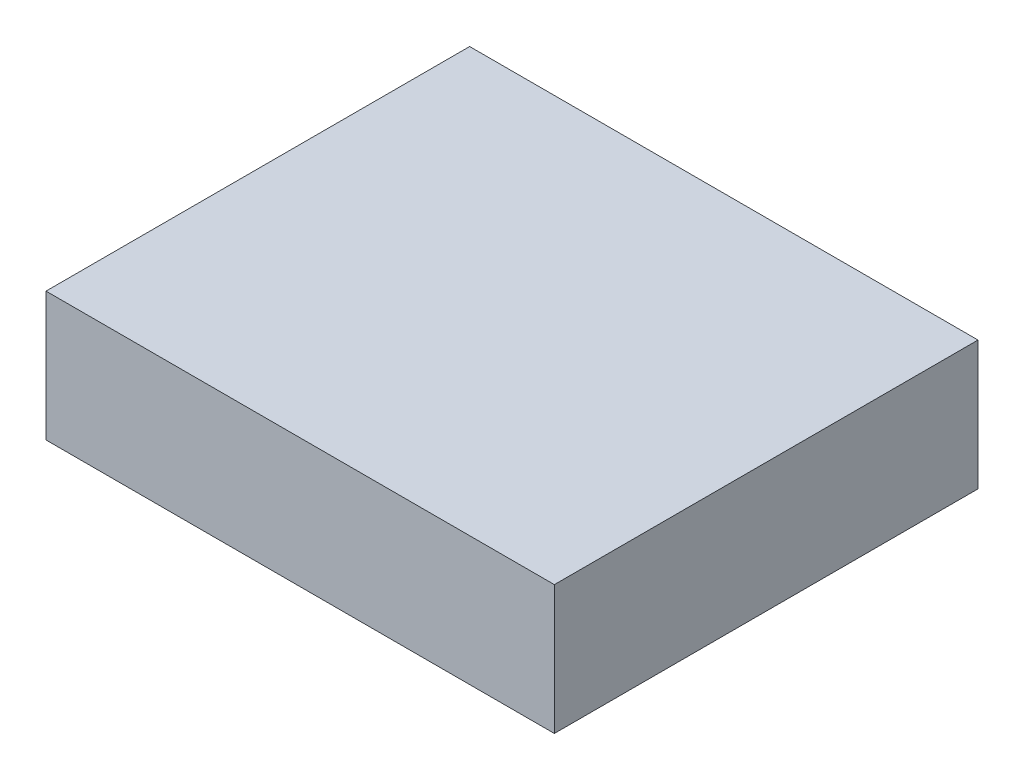
ISO-10303-21;
HEADER;
FILE_DESCRIPTION(('STEP AP214'),'2;1');
FILE_NAME('part.step','',(''),(''),'','','');
FILE_SCHEMA(('AUTOMOTIVE_DESIGN { 1 0 10303 214 1 1 1 1 }'));
ENDSEC;
DATA;
#1=APPLICATION_CONTEXT('core data for automotive mechanical design processes');
#2=APPLICATION_PROTOCOL_DEFINITION('international standard','automotive_design',2000,#1);
#3=PRODUCT_CONTEXT('',#1,'mechanical');
#4=PRODUCT('Part','Part','',(#3));
#5=PRODUCT_RELATED_PRODUCT_CATEGORY('part','',(#4));
#6=PRODUCT_DEFINITION_FORMATION('','',#4);
#7=PRODUCT_DEFINITION_CONTEXT('part definition',#1,'design');
#8=PRODUCT_DEFINITION('design','',#6,#7);
#9=PRODUCT_DEFINITION_SHAPE('','',#8);
#10=(LENGTH_UNIT() NAMED_UNIT(*) SI_UNIT(.MILLI.,.METRE.));
#11=(NAMED_UNIT(*) PLANE_ANGLE_UNIT() SI_UNIT($,.RADIAN.));
#12=(NAMED_UNIT(*) SI_UNIT($,.STERADIAN.) SOLID_ANGLE_UNIT());
#13=UNCERTAINTY_MEASURE_WITH_UNIT(LENGTH_MEASURE(1.E-05),#10,'distance_accuracy_value','');
#14=(GEOMETRIC_REPRESENTATION_CONTEXT(3) GLOBAL_UNCERTAINTY_ASSIGNED_CONTEXT((#13)) GLOBAL_UNIT_ASSIGNED_CONTEXT((#10,
#11,#12)) REPRESENTATION_CONTEXT('',''));
#15=CARTESIAN_POINT('',(0.,0.,0.));
#16=DIRECTION('',(0.,0.,1.));
#17=DIRECTION('',(1.,0.,0.));
#18=AXIS2_PLACEMENT_3D('',#15,#16,#17);
#19=CARTESIAN_POINT('',(-27.6,14.,23.));
#20=DIRECTION('',(1.,0.,0.));
#21=DIRECTION('',(0.,0.,-1.));
#22=AXIS2_PLACEMENT_3D('',#19,#20,#21);
#23=PLANE('',#22);
#24=DIRECTION('',(0.,0.,1.));
#25=VECTOR('',#24,1.);
#26=CARTESIAN_POINT('',(-27.6,0.,23.));
#27=LINE('',#26,#25);
#28=CARTESIAN_POINT('',(-27.6,0.,-23.));
#29=VERTEX_POINT('',#28);
#30=CARTESIAN_POINT('',(-27.6,0.,23.));
#31=VERTEX_POINT('',#30);
#32=EDGE_CURVE('E100',#29,#31,#27,.T.);
#33=ORIENTED_EDGE('',*,*,#32,.T.);
#34=DIRECTION('',(0.,-1.,0.));
#35=VECTOR('',#34,1.);
#36=CARTESIAN_POINT('',(-27.6,14.,23.));
#37=LINE('',#36,#35);
#38=CARTESIAN_POINT('',(-27.6,14.,23.));
#39=VERTEX_POINT('',#38);
#40=EDGE_CURVE('E11',#39,#31,#37,.T.);
#41=ORIENTED_EDGE('',*,*,#40,.F.);
#42=DIRECTION('',(0.,0.,1.));
#43=VECTOR('',#42,1.);
#44=CARTESIAN_POINT('',(-27.6,14.,23.));
#45=LINE('',#44,#43);
#46=CARTESIAN_POINT('',(-27.6,14.,-23.));
#47=VERTEX_POINT('',#46);
#48=EDGE_CURVE('E88',#47,#39,#45,.T.);
#49=ORIENTED_EDGE('',*,*,#48,.F.);
#50=DIRECTION('',(0.,-1.,0.));
#51=VECTOR('',#50,1.);
#52=CARTESIAN_POINT('',(-27.6,14.,-23.));
#53=LINE('',#52,#51);
#54=EDGE_CURVE('E96',#47,#29,#53,.T.);
#55=ORIENTED_EDGE('',*,*,#54,.T.);
#56=EDGE_LOOP('',(#33,#41,#49,#55));
#57=FACE_BOUND('',#56,.T.);
#58=ADVANCED_FACE('F37',(#57),#23,.F.);
#59=CARTESIAN_POINT('',(27.6,14.,23.));
#60=DIRECTION('',(0.,0.,-1.));
#61=DIRECTION('',(-1.,0.,0.));
#62=AXIS2_PLACEMENT_3D('',#59,#60,#61);
#63=PLANE('',#62);
#64=DIRECTION('',(1.,0.,0.));
#65=VECTOR('',#64,1.);
#66=CARTESIAN_POINT('',(27.6,0.,23.));
#67=LINE('',#66,#65);
#68=CARTESIAN_POINT('',(27.6,0.,23.));
#69=VERTEX_POINT('',#68);
#70=EDGE_CURVE('E92',#31,#69,#67,.T.);
#71=ORIENTED_EDGE('',*,*,#70,.T.);
#72=DIRECTION('',(0.,-1.,0.));
#73=VECTOR('',#72,1.);
#74=CARTESIAN_POINT('',(27.6,14.,23.));
#75=LINE('',#74,#73);
#76=CARTESIAN_POINT('',(27.6,14.,23.));
#77=VERTEX_POINT('',#76);
#78=EDGE_CURVE('E45',#77,#69,#75,.T.);
#79=ORIENTED_EDGE('',*,*,#78,.F.);
#80=DIRECTION('',(1.,0.,0.));
#81=VECTOR('',#80,1.);
#82=CARTESIAN_POINT('',(27.6,14.,23.));
#83=LINE('',#82,#81);
#84=EDGE_CURVE('E83',#39,#77,#83,.T.);
#85=ORIENTED_EDGE('',*,*,#84,.F.);
#86=ORIENTED_EDGE('',*,*,#40,.T.);
#87=EDGE_LOOP('',(#71,#79,#85,#86));
#88=FACE_BOUND('',#87,.T.);
#89=ADVANCED_FACE('F91',(#88),#63,.F.);
#90=CARTESIAN_POINT('',(27.6,14.,23.));
#91=DIRECTION('',(-1.,0.,0.));
#92=DIRECTION('',(0.,0.,1.));
#93=AXIS2_PLACEMENT_3D('',#90,#91,#92);
#94=PLANE('',#93);
#95=DIRECTION('',(0.,0.,-1.));
#96=VECTOR('',#95,1.);
#97=CARTESIAN_POINT('',(27.6,0.,23.));
#98=LINE('',#97,#96);
#99=CARTESIAN_POINT('',(27.6,0.,-23.));
#100=VERTEX_POINT('',#99);
#101=EDGE_CURVE('E70',#69,#100,#98,.T.);
#102=ORIENTED_EDGE('',*,*,#101,.T.);
#103=DIRECTION('',(0.,-1.,0.));
#104=VECTOR('',#103,1.);
#105=CARTESIAN_POINT('',(27.6,14.,-23.));
#106=LINE('',#105,#104);
#107=CARTESIAN_POINT('',(27.6,14.,-23.));
#108=VERTEX_POINT('',#107);
#109=EDGE_CURVE('E93',#108,#100,#106,.T.);
#110=ORIENTED_EDGE('',*,*,#109,.F.);
#111=DIRECTION('',(0.,0.,-1.));
#112=VECTOR('',#111,1.);
#113=CARTESIAN_POINT('',(27.6,14.,23.));
#114=LINE('',#113,#112);
#115=EDGE_CURVE('E86',#77,#108,#114,.T.);
#116=ORIENTED_EDGE('',*,*,#115,.F.);
#117=ORIENTED_EDGE('',*,*,#78,.T.);
#118=EDGE_LOOP('',(#102,#110,#116,#117));
#119=FACE_BOUND('',#118,.T.);
#120=ADVANCED_FACE('F94',(#119),#94,.F.);
#121=CARTESIAN_POINT('',(27.6,14.,-23.));
#122=DIRECTION('',(0.,0.,1.));
#123=DIRECTION('',(1.,0.,0.));
#124=AXIS2_PLACEMENT_3D('',#121,#122,#123);
#125=PLANE('',#124);
#126=DIRECTION('',(-1.,0.,0.));
#127=VECTOR('',#126,1.);
#128=CARTESIAN_POINT('',(27.6,0.,-23.));
#129=LINE('',#128,#127);
#130=EDGE_CURVE('E76',#100,#29,#129,.T.);
#131=ORIENTED_EDGE('',*,*,#130,.T.);
#132=ORIENTED_EDGE('',*,*,#54,.F.);
#133=DIRECTION('',(-1.,0.,0.));
#134=VECTOR('',#133,1.);
#135=CARTESIAN_POINT('',(27.6,14.,-23.));
#136=LINE('',#135,#134);
#137=EDGE_CURVE('E53',#108,#47,#136,.T.);
#138=ORIENTED_EDGE('',*,*,#137,.F.);
#139=ORIENTED_EDGE('',*,*,#109,.T.);
#140=EDGE_LOOP('',(#131,#132,#138,#139));
#141=FACE_BOUND('',#140,.T.);
#142=ADVANCED_FACE('F107',(#141),#125,.F.);
#143=CARTESIAN_POINT('',(0.,14.,0.));
#144=DIRECTION('',(0.,1.,0.));
#145=DIRECTION('',(0.,0.,1.));
#146=AXIS2_PLACEMENT_3D('',#143,#144,#145);
#147=PLANE('',#146);
#148=ORIENTED_EDGE('',*,*,#48,.T.);
#149=ORIENTED_EDGE('',*,*,#84,.T.);
#150=ORIENTED_EDGE('',*,*,#115,.T.);
#151=ORIENTED_EDGE('',*,*,#137,.T.);
#152=EDGE_LOOP('',(#148,#149,#150,#151));
#153=FACE_BOUND('',#152,.T.);
#154=ADVANCED_FACE('F84',(#153),#147,.T.);
#155=CARTESIAN_POINT('',(0.,0.,0.));
#156=DIRECTION('',(0.,1.,0.));
#157=DIRECTION('',(0.,0.,1.));
#158=AXIS2_PLACEMENT_3D('',#155,#156,#157);
#159=PLANE('',#158);
#160=ORIENTED_EDGE('',*,*,#32,.F.);
#161=ORIENTED_EDGE('',*,*,#130,.F.);
#162=ORIENTED_EDGE('',*,*,#101,.F.);
#163=ORIENTED_EDGE('',*,*,#70,.F.);
#164=EDGE_LOOP('',(#160,#161,#162,#163));
#165=FACE_BOUND('',#164,.T.);
#166=ADVANCED_FACE('F110',(#165),#159,.F.);
#167=CLOSED_SHELL('',(#58,#89,#120,#142,#154,#166));
#168=MANIFOLD_SOLID_BREP('B2',#167);
#169=ADVANCED_BREP_SHAPE_REPRESENTATION('',(#18,#168),#14);
#170=SHAPE_DEFINITION_REPRESENTATION(#9,#169);
ENDSEC;
END-ISO-10303-21;
